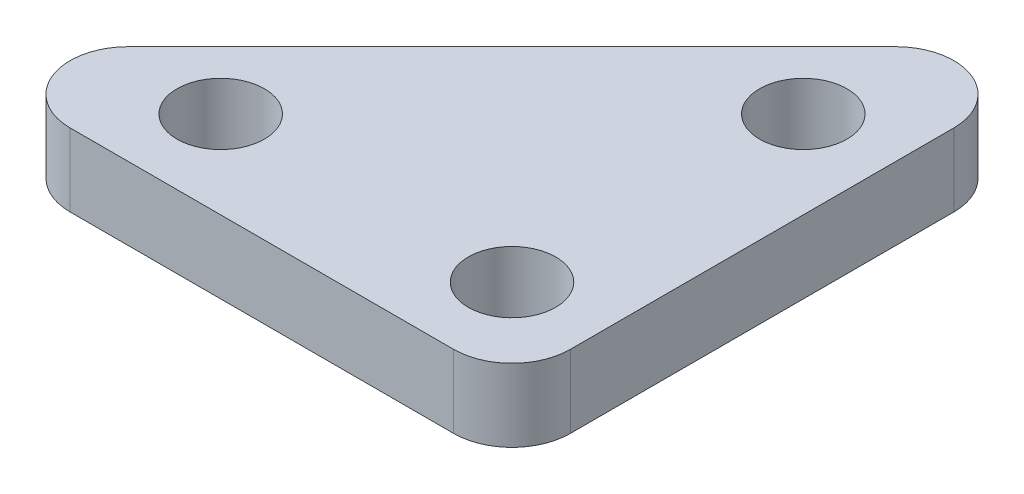
ISO-10303-21;
HEADER;
FILE_DESCRIPTION(('STEP AP214'),'2;1');
FILE_NAME('part.step','',(''),(''),'','','');
FILE_SCHEMA(('AUTOMOTIVE_DESIGN { 1 0 10303 214 1 1 1 1 }'));
ENDSEC;
DATA;
#1=APPLICATION_CONTEXT('core data for automotive mechanical design processes');
#2=APPLICATION_PROTOCOL_DEFINITION('international standard','automotive_design',2000,#1);
#3=PRODUCT_CONTEXT('',#1,'mechanical');
#4=PRODUCT('Part','Part','',(#3));
#5=PRODUCT_RELATED_PRODUCT_CATEGORY('part','',(#4));
#6=PRODUCT_DEFINITION_FORMATION('','',#4);
#7=PRODUCT_DEFINITION_CONTEXT('part definition',#1,'design');
#8=PRODUCT_DEFINITION('design','',#6,#7);
#9=PRODUCT_DEFINITION_SHAPE('','',#8);
#10=(LENGTH_UNIT() NAMED_UNIT(*) SI_UNIT(.MILLI.,.METRE.));
#11=(NAMED_UNIT(*) PLANE_ANGLE_UNIT() SI_UNIT($,.RADIAN.));
#12=(NAMED_UNIT(*) SI_UNIT($,.STERADIAN.) SOLID_ANGLE_UNIT());
#13=UNCERTAINTY_MEASURE_WITH_UNIT(LENGTH_MEASURE(1.E-05),#10,'distance_accuracy_value','');
#14=(GEOMETRIC_REPRESENTATION_CONTEXT(3) GLOBAL_UNCERTAINTY_ASSIGNED_CONTEXT((#13)) GLOBAL_UNIT_ASSIGNED_CONTEXT((#10,
#11,#12)) REPRESENTATION_CONTEXT('',''));
#15=CARTESIAN_POINT('',(0.,0.,0.));
#16=DIRECTION('',(0.,0.,1.));
#17=DIRECTION('',(1.,0.,0.));
#18=AXIS2_PLACEMENT_3D('',#15,#16,#17);
#19=CARTESIAN_POINT('',(-21.0435268374189,2.5,13.4801838731496));
#20=DIRECTION('',(0.707106781186548,0.,0.707106781186547));
#21=DIRECTION('',(0.707106781186547,0.,-0.707106781186548));
#22=AXIS2_PLACEMENT_3D('',#19,#20,#21);
#23=PLANE('',#22);
#24=DIRECTION('',(-0.707106781186547,0.,0.707106781186548));
#25=VECTOR('',#24,1.);
#26=CARTESIAN_POINT('',(-21.0435268374189,0.,13.4801838731496));
#27=LINE('',#26,#25);
#28=CARTESIAN_POINT('',(-4.45774039979198,0.,-3.1056025644773));
#29=VERTEX_POINT('',#28);
#30=CARTESIAN_POINT('',(-17.6293132750458,0.,10.0659703107765));
#31=VERTEX_POINT('',#30);
#32=EDGE_CURVE('E116',#29,#31,#27,.T.);
#33=ORIENTED_EDGE('',*,*,#32,.T.);
#34=DIRECTION('',(0.,-1.,0.));
#35=VECTOR('',#34,1.);
#36=CARTESIAN_POINT('',(-17.6293132750458,2.5,10.0659703107765));
#37=LINE('',#36,#35);
#38=CARTESIAN_POINT('',(-17.6293132750458,2.5,10.0659703107765));
#39=VERTEX_POINT('',#38);
#40=EDGE_CURVE('E11',#31,#39,#37,.F.);
#41=ORIENTED_EDGE('',*,*,#40,.T.);
#42=DIRECTION('',(-0.707106781186547,0.,0.707106781186548));
#43=VECTOR('',#42,1.);
#44=CARTESIAN_POINT('',(-21.0435268374189,2.5,13.4801838731496));
#45=LINE('',#44,#43);
#46=CARTESIAN_POINT('',(-4.45774039979198,2.5,-3.1056025644773));
#47=VERTEX_POINT('',#46);
#48=EDGE_CURVE('E111',#47,#39,#45,.T.);
#49=ORIENTED_EDGE('',*,*,#48,.F.);
#50=DIRECTION('',(0.,-1.,0.));
#51=VECTOR('',#50,1.);
#52=CARTESIAN_POINT('',(-4.45774039979198,2.5,-3.10560256447729));
#53=LINE('',#52,#51);
#54=EDGE_CURVE('E41',#47,#29,#53,.T.);
#55=ORIENTED_EDGE('',*,*,#54,.T.);
#56=EDGE_LOOP('',(#33,#41,#49,#55));
#57=FACE_BOUND('',#56,.T.);
#58=ADVANCED_FACE('F33',(#57),#23,.F.);
#59=CARTESIAN_POINT('',(-1.04352683741888,2.5,13.4801838731496));
#60=DIRECTION('',(0.,0.,-1.));
#61=DIRECTION('',(-1.,0.,0.));
#62=AXIS2_PLACEMENT_3D('',#59,#60,#61);
#63=PLANE('',#62);
#64=DIRECTION('',(1.,0.,0.));
#65=VECTOR('',#64,1.);
#66=CARTESIAN_POINT('',(-1.04352683741888,0.,13.4801838731496));
#67=LINE('',#66,#65);
#68=CARTESIAN_POINT('',(-16.2150997126727,0.,13.4801838731496));
#69=VERTEX_POINT('',#68);
#70=CARTESIAN_POINT('',(-3.04352683741888,0.,13.4801838731496));
#71=VERTEX_POINT('',#70);
#72=EDGE_CURVE('E112',#69,#71,#67,.T.);
#73=ORIENTED_EDGE('',*,*,#72,.T.);
#74=DIRECTION('',(0.,-1.,0.));
#75=VECTOR('',#74,1.);
#76=CARTESIAN_POINT('',(-3.04352683741888,2.5,13.4801838731496));
#77=LINE('',#76,#75);
#78=CARTESIAN_POINT('',(-3.04352683741888,2.5,13.4801838731496));
#79=VERTEX_POINT('',#78);
#80=EDGE_CURVE('E91',#71,#79,#77,.F.);
#81=ORIENTED_EDGE('',*,*,#80,.T.);
#82=DIRECTION('',(1.,0.,0.));
#83=VECTOR('',#82,1.);
#84=CARTESIAN_POINT('',(-1.04352683741888,2.5,13.4801838731496));
#85=LINE('',#84,#83);
#86=CARTESIAN_POINT('',(-16.2150997126727,2.5,13.4801838731496));
#87=VERTEX_POINT('',#86);
#88=EDGE_CURVE('E114',#87,#79,#85,.T.);
#89=ORIENTED_EDGE('',*,*,#88,.F.);
#90=DIRECTION('',(0.,-1.,0.));
#91=VECTOR('',#90,1.);
#92=CARTESIAN_POINT('',(-16.2150997126727,2.5,13.4801838731496));
#93=LINE('',#92,#91);
#94=EDGE_CURVE('E96',#87,#69,#93,.T.);
#95=ORIENTED_EDGE('',*,*,#94,.T.);
#96=EDGE_LOOP('',(#73,#81,#89,#95));
#97=FACE_BOUND('',#96,.T.);
#98=ADVANCED_FACE('F176',(#97),#63,.F.);
#99=CARTESIAN_POINT('',(-1.04352683741888,2.5,-6.51981612685039));
#100=DIRECTION('',(-1.,0.,0.));
#101=DIRECTION('',(0.,0.,1.));
#102=AXIS2_PLACEMENT_3D('',#99,#100,#101);
#103=PLANE('',#102);
#104=DIRECTION('',(0.,0.,-1.));
#105=VECTOR('',#104,1.);
#106=CARTESIAN_POINT('',(-1.04352683741888,2.5,-6.51981612685039));
#107=LINE('',#106,#105);
#108=CARTESIAN_POINT('',(-1.04352683741888,2.5,11.4801838731496));
#109=VERTEX_POINT('',#108);
#110=CARTESIAN_POINT('',(-1.04352683741888,2.5,-1.6913890021042));
#111=VERTEX_POINT('',#110);
#112=EDGE_CURVE('E105',#109,#111,#107,.T.);
#113=ORIENTED_EDGE('',*,*,#112,.F.);
#114=DIRECTION('',(0.,-1.,0.));
#115=VECTOR('',#114,1.);
#116=CARTESIAN_POINT('',(-1.04352683741888,2.5,11.4801838731496));
#117=LINE('',#116,#115);
#118=CARTESIAN_POINT('',(-1.04352683741888,0.,11.4801838731496));
#119=VERTEX_POINT('',#118);
#120=EDGE_CURVE('E90',#109,#119,#117,.T.);
#121=ORIENTED_EDGE('',*,*,#120,.T.);
#122=DIRECTION('',(0.,0.,-1.));
#123=VECTOR('',#122,1.);
#124=CARTESIAN_POINT('',(-1.04352683741888,0.,-6.51981612685039));
#125=LINE('',#124,#123);
#126=CARTESIAN_POINT('',(-1.04352683741888,0.,-1.6913890021042));
#127=VERTEX_POINT('',#126);
#128=EDGE_CURVE('E103',#119,#127,#125,.T.);
#129=ORIENTED_EDGE('',*,*,#128,.T.);
#130=DIRECTION('',(0.,-1.,0.));
#131=VECTOR('',#130,1.);
#132=CARTESIAN_POINT('',(-1.04352683741888,2.5,-1.6913890021042));
#133=LINE('',#132,#131);
#134=EDGE_CURVE('E107',#127,#111,#133,.F.);
#135=ORIENTED_EDGE('',*,*,#134,.T.);
#136=EDGE_LOOP('',(#113,#121,#129,#135));
#137=FACE_BOUND('',#136,.T.);
#138=ADVANCED_FACE('F102',(#137),#103,.F.);
#139=CARTESIAN_POINT('',(0.,2.5,0.));
#140=DIRECTION('',(0.,-1.,0.));
#141=DIRECTION('',(0.,0.,-1.));
#142=AXIS2_PLACEMENT_3D('',#139,#140,#141);
#143=PLANE('',#142);
#144=CARTESIAN_POINT('',(-14.0435268374189,2.5,10.4801838731496));
#145=DIRECTION('',(0.,1.,0.));
#146=DIRECTION('',(0.,0.,1.));
#147=AXIS2_PLACEMENT_3D('',#144,#145,#146);
#148=CIRCLE('',#147,1.5);
#149=CARTESIAN_POINT('',(-14.0435268374189,2.5,11.9801838731496));
#150=VERTEX_POINT('',#149);
#151=EDGE_CURVE('E150',#150,#150,#148,.T.);
#152=ORIENTED_EDGE('',*,*,#151,.F.);
#153=EDGE_LOOP('',(#152));
#154=FACE_BOUND('',#153,.T.);
#155=CARTESIAN_POINT('',(-4.04352683741888,2.5,10.4801838731496));
#156=DIRECTION('',(0.,1.,0.));
#157=DIRECTION('',(0.,0.,1.));
#158=AXIS2_PLACEMENT_3D('',#155,#156,#157);
#159=CIRCLE('',#158,1.5);
#160=CARTESIAN_POINT('',(-4.04352683741888,2.5,11.9801838731496));
#161=VERTEX_POINT('',#160);
#162=EDGE_CURVE('E144',#161,#161,#159,.T.);
#163=ORIENTED_EDGE('',*,*,#162,.F.);
#164=EDGE_LOOP('',(#163));
#165=FACE_BOUND('',#164,.T.);
#166=CARTESIAN_POINT('',(-4.04352683741888,2.5,0.480183873149612));
#167=DIRECTION('',(0.,1.,0.));
#168=DIRECTION('',(0.,0.,1.));
#169=AXIS2_PLACEMENT_3D('',#166,#167,#168);
#170=CIRCLE('',#169,1.5);
#171=CARTESIAN_POINT('',(-4.04352683741888,2.5,1.98018387314961));
#172=VERTEX_POINT('',#171);
#173=EDGE_CURVE('E135',#172,#172,#170,.T.);
#174=ORIENTED_EDGE('',*,*,#173,.F.);
#175=EDGE_LOOP('',(#174));
#176=FACE_BOUND('',#175,.T.);
#177=ORIENTED_EDGE('',*,*,#88,.T.);
#178=CARTESIAN_POINT('',(-3.04352683741888,2.5,11.4801838731496));
#179=DIRECTION('',(0.,-1.,0.));
#180=DIRECTION('',(0.,0.,-1.));
#181=AXIS2_PLACEMENT_3D('',#178,#179,#180);
#182=CIRCLE('',#181,2.);
#183=EDGE_CURVE('E129',#79,#109,#182,.F.);
#184=ORIENTED_EDGE('',*,*,#183,.T.);
#185=ORIENTED_EDGE('',*,*,#112,.T.);
#186=CARTESIAN_POINT('',(-3.04352683741888,2.5,-1.6913890021042));
#187=DIRECTION('',(0.,-1.,0.));
#188=DIRECTION('',(0.,0.,-1.));
#189=AXIS2_PLACEMENT_3D('',#186,#187,#188);
#190=CIRCLE('',#189,2.);
#191=EDGE_CURVE('E53',#111,#47,#190,.F.);
#192=ORIENTED_EDGE('',*,*,#191,.T.);
#193=ORIENTED_EDGE('',*,*,#48,.T.);
#194=CARTESIAN_POINT('',(-16.2150997126727,2.5,11.4801838731496));
#195=DIRECTION('',(0.,-1.,0.));
#196=DIRECTION('',(0.,0.,-1.));
#197=AXIS2_PLACEMENT_3D('',#194,#195,#196);
#198=CIRCLE('',#197,2.);
#199=EDGE_CURVE('E127',#39,#87,#198,.F.);
#200=ORIENTED_EDGE('',*,*,#199,.T.);
#201=EDGE_LOOP('',(#177,#184,#185,#192,#193,#200));
#202=FACE_BOUND('',#201,.T.);
#203=ADVANCED_FACE('F165',(#154,#165,#176,#202),#143,.F.);
#204=CARTESIAN_POINT('',(0.,0.,0.));
#205=DIRECTION('',(0.,-1.,0.));
#206=DIRECTION('',(0.,0.,-1.));
#207=AXIS2_PLACEMENT_3D('',#204,#205,#206);
#208=PLANE('',#207);
#209=CARTESIAN_POINT('',(-14.0435268374189,0.,10.4801838731496));
#210=DIRECTION('',(0.,1.,0.));
#211=DIRECTION('',(0.,0.,1.));
#212=AXIS2_PLACEMENT_3D('',#209,#210,#211);
#213=CIRCLE('',#212,1.5);
#214=CARTESIAN_POINT('',(-14.0435268374189,0.,11.9801838731496));
#215=VERTEX_POINT('',#214);
#216=EDGE_CURVE('E147',#215,#215,#213,.T.);
#217=ORIENTED_EDGE('',*,*,#216,.T.);
#218=EDGE_LOOP('',(#217));
#219=FACE_BOUND('',#218,.T.);
#220=CARTESIAN_POINT('',(-4.04352683741888,0.,10.4801838731496));
#221=DIRECTION('',(0.,1.,0.));
#222=DIRECTION('',(0.,0.,1.));
#223=AXIS2_PLACEMENT_3D('',#220,#221,#222);
#224=CIRCLE('',#223,1.5);
#225=CARTESIAN_POINT('',(-4.04352683741888,0.,11.9801838731496));
#226=VERTEX_POINT('',#225);
#227=EDGE_CURVE('E142',#226,#226,#224,.T.);
#228=ORIENTED_EDGE('',*,*,#227,.T.);
#229=EDGE_LOOP('',(#228));
#230=FACE_BOUND('',#229,.T.);
#231=CARTESIAN_POINT('',(-4.04352683741888,0.,0.480183873149612));
#232=DIRECTION('',(0.,1.,0.));
#233=DIRECTION('',(0.,0.,1.));
#234=AXIS2_PLACEMENT_3D('',#231,#232,#233);
#235=CIRCLE('',#234,1.5);
#236=CARTESIAN_POINT('',(-4.04352683741888,0.,1.98018387314961));
#237=VERTEX_POINT('',#236);
#238=EDGE_CURVE('E133',#237,#237,#235,.T.);
#239=ORIENTED_EDGE('',*,*,#238,.T.);
#240=EDGE_LOOP('',(#239));
#241=FACE_BOUND('',#240,.T.);
#242=ORIENTED_EDGE('',*,*,#128,.F.);
#243=CARTESIAN_POINT('',(-3.04352683741888,0.,11.4801838731496));
#244=DIRECTION('',(0.,-1.,0.));
#245=DIRECTION('',(0.,0.,-1.));
#246=AXIS2_PLACEMENT_3D('',#243,#244,#245);
#247=CIRCLE('',#246,2.);
#248=EDGE_CURVE('E86',#119,#71,#247,.T.);
#249=ORIENTED_EDGE('',*,*,#248,.T.);
#250=ORIENTED_EDGE('',*,*,#72,.F.);
#251=CARTESIAN_POINT('',(-16.2150997126727,0.,11.4801838731496));
#252=DIRECTION('',(0.,-1.,0.));
#253=DIRECTION('',(0.,0.,-1.));
#254=AXIS2_PLACEMENT_3D('',#251,#252,#253);
#255=CIRCLE('',#254,2.);
#256=EDGE_CURVE('E97',#69,#31,#255,.T.);
#257=ORIENTED_EDGE('',*,*,#256,.T.);
#258=ORIENTED_EDGE('',*,*,#32,.F.);
#259=CARTESIAN_POINT('',(-3.04352683741888,0.,-1.6913890021042));
#260=DIRECTION('',(0.,-1.,0.));
#261=DIRECTION('',(0.,0.,-1.));
#262=AXIS2_PLACEMENT_3D('',#259,#260,#261);
#263=CIRCLE('',#262,2.);
#264=EDGE_CURVE('E106',#29,#127,#263,.T.);
#265=ORIENTED_EDGE('',*,*,#264,.T.);
#266=EDGE_LOOP('',(#242,#249,#250,#257,#258,#265));
#267=FACE_BOUND('',#266,.T.);
#268=ADVANCED_FACE('F109',(#219,#230,#241,#267),#208,.T.);
#269=CARTESIAN_POINT('',(-3.04352683741888,2.5,11.4801838731496));
#270=DIRECTION('',(0.,-1.,0.));
#271=DIRECTION('',(0.,0.,-1.));
#272=AXIS2_PLACEMENT_3D('',#269,#270,#271);
#273=CYLINDRICAL_SURFACE('',#272,2.);
#274=ORIENTED_EDGE('',*,*,#183,.F.);
#275=ORIENTED_EDGE('',*,*,#80,.F.);
#276=ORIENTED_EDGE('',*,*,#248,.F.);
#277=ORIENTED_EDGE('',*,*,#120,.F.);
#278=EDGE_LOOP('',(#274,#275,#276,#277));
#279=FACE_BOUND('',#278,.T.);
#280=ADVANCED_FACE('F89',(#279),#273,.T.);
#281=CARTESIAN_POINT('',(-16.2150997126727,2.5,11.4801838731496));
#282=DIRECTION('',(0.,-1.,0.));
#283=DIRECTION('',(0.,0.,-1.));
#284=AXIS2_PLACEMENT_3D('',#281,#282,#283);
#285=CYLINDRICAL_SURFACE('',#284,2.);
#286=ORIENTED_EDGE('',*,*,#199,.F.);
#287=ORIENTED_EDGE('',*,*,#40,.F.);
#288=ORIENTED_EDGE('',*,*,#256,.F.);
#289=ORIENTED_EDGE('',*,*,#94,.F.);
#290=EDGE_LOOP('',(#286,#287,#288,#289));
#291=FACE_BOUND('',#290,.T.);
#292=ADVANCED_FACE('F178',(#291),#285,.T.);
#293=CARTESIAN_POINT('',(-3.04352683741888,2.5,-1.6913890021042));
#294=DIRECTION('',(0.,-1.,0.));
#295=DIRECTION('',(0.,0.,-1.));
#296=AXIS2_PLACEMENT_3D('',#293,#294,#295);
#297=CYLINDRICAL_SURFACE('',#296,2.);
#298=ORIENTED_EDGE('',*,*,#191,.F.);
#299=ORIENTED_EDGE('',*,*,#134,.F.);
#300=ORIENTED_EDGE('',*,*,#264,.F.);
#301=ORIENTED_EDGE('',*,*,#54,.F.);
#302=EDGE_LOOP('',(#298,#299,#300,#301));
#303=FACE_BOUND('',#302,.T.);
#304=ADVANCED_FACE('F35',(#303),#297,.T.);
#305=CARTESIAN_POINT('',(-4.04352683741888,0.,0.480183873149612));
#306=DIRECTION('',(0.,1.,0.));
#307=DIRECTION('',(0.,0.,1.));
#308=AXIS2_PLACEMENT_3D('',#305,#306,#307);
#309=CYLINDRICAL_SURFACE('',#308,1.5);
#310=ORIENTED_EDGE('',*,*,#238,.F.);
#311=EDGE_LOOP('',(#310));
#312=FACE_BOUND('',#311,.T.);
#313=ORIENTED_EDGE('',*,*,#173,.T.);
#314=EDGE_LOOP('',(#313));
#315=FACE_BOUND('',#314,.T.);
#316=ADVANCED_FACE('F184',(#312,#315),#309,.F.);
#317=CARTESIAN_POINT('',(-4.04352683741888,0.,10.4801838731496));
#318=DIRECTION('',(0.,1.,0.));
#319=DIRECTION('',(0.,0.,1.));
#320=AXIS2_PLACEMENT_3D('',#317,#318,#319);
#321=CYLINDRICAL_SURFACE('',#320,1.5);
#322=ORIENTED_EDGE('',*,*,#227,.F.);
#323=EDGE_LOOP('',(#322));
#324=FACE_BOUND('',#323,.T.);
#325=ORIENTED_EDGE('',*,*,#162,.T.);
#326=EDGE_LOOP('',(#325));
#327=FACE_BOUND('',#326,.T.);
#328=ADVANCED_FACE('F161',(#324,#327),#321,.F.);
#329=CARTESIAN_POINT('',(-14.0435268374189,0.,10.4801838731496));
#330=DIRECTION('',(0.,1.,0.));
#331=DIRECTION('',(0.,0.,1.));
#332=AXIS2_PLACEMENT_3D('',#329,#330,#331);
#333=CYLINDRICAL_SURFACE('',#332,1.5);
#334=ORIENTED_EDGE('',*,*,#216,.F.);
#335=EDGE_LOOP('',(#334));
#336=FACE_BOUND('',#335,.T.);
#337=ORIENTED_EDGE('',*,*,#151,.T.);
#338=EDGE_LOOP('',(#337));
#339=FACE_BOUND('',#338,.T.);
#340=ADVANCED_FACE('F158',(#336,#339),#333,.F.);
#341=CLOSED_SHELL('',(#58,#98,#138,#203,#268,#280,#292,#304,#316,#328,#340));
#342=MANIFOLD_SOLID_BREP('B2',#341);
#343=ADVANCED_BREP_SHAPE_REPRESENTATION('',(#18,#342),#14);
#344=SHAPE_DEFINITION_REPRESENTATION(#9,#343);
ENDSEC;
END-ISO-10303-21;
